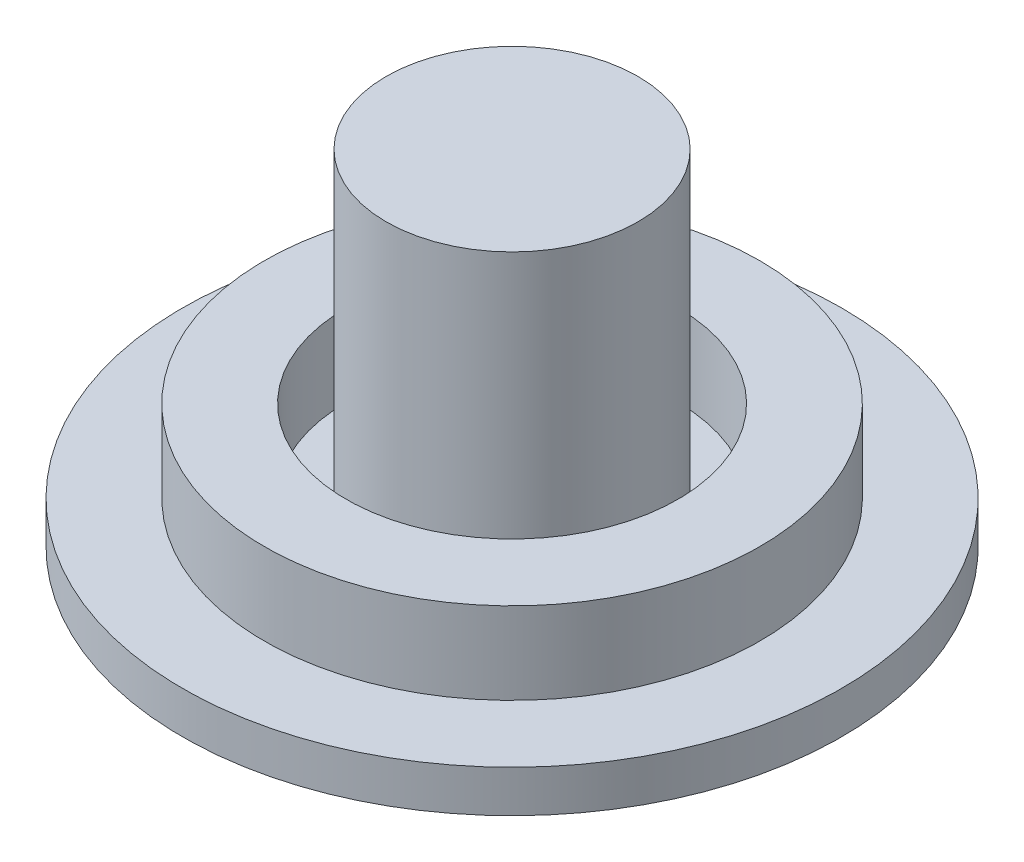
ISO-10303-21;
HEADER;
FILE_DESCRIPTION(('STEP AP214'),'2;1');
FILE_NAME('part.step','',(''),(''),'','','');
FILE_SCHEMA(('AUTOMOTIVE_DESIGN { 1 0 10303 214 1 1 1 1 }'));
ENDSEC;
DATA;
#1=APPLICATION_CONTEXT('core data for automotive mechanical design processes');
#2=APPLICATION_PROTOCOL_DEFINITION('international standard','automotive_design',2000,#1);
#3=PRODUCT_CONTEXT('',#1,'mechanical');
#4=PRODUCT('Part','Part','',(#3));
#5=PRODUCT_RELATED_PRODUCT_CATEGORY('part','',(#4));
#6=PRODUCT_DEFINITION_FORMATION('','',#4);
#7=PRODUCT_DEFINITION_CONTEXT('part definition',#1,'design');
#8=PRODUCT_DEFINITION('design','',#6,#7);
#9=PRODUCT_DEFINITION_SHAPE('','',#8);
#10=(LENGTH_UNIT() NAMED_UNIT(*) SI_UNIT(.MILLI.,.METRE.));
#11=(NAMED_UNIT(*) PLANE_ANGLE_UNIT() SI_UNIT($,.RADIAN.));
#12=(NAMED_UNIT(*) SI_UNIT($,.STERADIAN.) SOLID_ANGLE_UNIT());
#13=UNCERTAINTY_MEASURE_WITH_UNIT(LENGTH_MEASURE(1.E-05),#10,'distance_accuracy_value','');
#14=(GEOMETRIC_REPRESENTATION_CONTEXT(3) GLOBAL_UNCERTAINTY_ASSIGNED_CONTEXT((#13)) GLOBAL_UNIT_ASSIGNED_CONTEXT((#10,
#11,#12)) REPRESENTATION_CONTEXT('',''));
#15=CARTESIAN_POINT('',(0.,0.,0.));
#16=DIRECTION('',(0.,0.,1.));
#17=DIRECTION('',(1.,0.,0.));
#18=AXIS2_PLACEMENT_3D('',#15,#16,#17);
#19=CARTESIAN_POINT('',(0.,8.2,0.));
#20=DIRECTION('',(0.,1.,0.));
#21=DIRECTION('',(0.,0.,1.));
#22=AXIS2_PLACEMENT_3D('',#19,#20,#21);
#23=PLANE('',#22);
#24=CARTESIAN_POINT('',(0.,8.2,0.));
#25=DIRECTION('',(0.,-1.,0.));
#26=DIRECTION('',(0.,0.,-1.));
#27=AXIS2_PLACEMENT_3D('',#24,#25,#26);
#28=CIRCLE('',#27,3.);
#29=CARTESIAN_POINT('',(0.,8.2,-3.));
#30=VERTEX_POINT('',#29);
#31=EDGE_CURVE('E10',#30,#30,#28,.T.);
#32=ORIENTED_EDGE('',*,*,#31,.F.);
#33=EDGE_LOOP('',(#32));
#34=FACE_BOUND('',#33,.T.);
#35=ADVANCED_FACE('F32',(#34),#23,.T.);
#36=CARTESIAN_POINT('',(0.,0.,0.));
#37=DIRECTION('',(0.,-1.,0.));
#38=DIRECTION('',(0.,0.,-1.));
#39=AXIS2_PLACEMENT_3D('',#36,#37,#38);
#40=CYLINDRICAL_SURFACE('',#39,3.);
#41=ORIENTED_EDGE('',*,*,#31,.T.);
#42=EDGE_LOOP('',(#41));
#43=FACE_BOUND('',#42,.T.);
#44=CARTESIAN_POINT('',(0.,1.,0.));
#45=DIRECTION('',(0.,-1.,0.));
#46=DIRECTION('',(0.,0.,-1.));
#47=AXIS2_PLACEMENT_3D('',#44,#45,#46);
#48=CIRCLE('',#47,3.);
#49=CARTESIAN_POINT('',(0.,1.,-3.));
#50=VERTEX_POINT('',#49);
#51=EDGE_CURVE('E38',#50,#50,#48,.T.);
#52=ORIENTED_EDGE('',*,*,#51,.F.);
#53=EDGE_LOOP('',(#52));
#54=FACE_BOUND('',#53,.T.);
#55=ADVANCED_FACE('F80',(#43,#54),#40,.T.);
#56=CARTESIAN_POINT('',(0.,1.,-3.95));
#57=DIRECTION('',(0.,1.,0.));
#58=DIRECTION('',(0.,0.,1.));
#59=AXIS2_PLACEMENT_3D('',#56,#57,#58);
#60=PLANE('',#59);
#61=ORIENTED_EDGE('',*,*,#51,.T.);
#62=EDGE_LOOP('',(#61));
#63=FACE_BOUND('',#62,.T.);
#64=CARTESIAN_POINT('',(0.,1.,0.));
#65=DIRECTION('',(0.,-1.,0.));
#66=DIRECTION('',(0.,0.,-1.));
#67=AXIS2_PLACEMENT_3D('',#64,#65,#66);
#68=CIRCLE('',#67,3.95);
#69=CARTESIAN_POINT('',(0.,1.,-3.95));
#70=VERTEX_POINT('',#69);
#71=EDGE_CURVE('E42',#70,#70,#68,.T.);
#72=ORIENTED_EDGE('',*,*,#71,.F.);
#73=EDGE_LOOP('',(#72));
#74=FACE_BOUND('',#73,.T.);
#75=ADVANCED_FACE('F85',(#63,#74),#60,.T.);
#76=CARTESIAN_POINT('',(0.,0.,0.));
#77=DIRECTION('',(0.,-1.,0.));
#78=DIRECTION('',(0.,0.,-1.));
#79=AXIS2_PLACEMENT_3D('',#76,#77,#78);
#80=CYLINDRICAL_SURFACE('',#79,3.95);
#81=ORIENTED_EDGE('',*,*,#71,.T.);
#82=EDGE_LOOP('',(#81));
#83=FACE_BOUND('',#82,.T.);
#84=CARTESIAN_POINT('',(0.,2.95,0.));
#85=DIRECTION('',(0.,-1.,0.));
#86=DIRECTION('',(0.,0.,-1.));
#87=AXIS2_PLACEMENT_3D('',#84,#85,#86);
#88=CIRCLE('',#87,3.95);
#89=CARTESIAN_POINT('',(0.,2.95,-3.95));
#90=VERTEX_POINT('',#89);
#91=EDGE_CURVE('E46',#90,#90,#88,.T.);
#92=ORIENTED_EDGE('',*,*,#91,.F.);
#93=EDGE_LOOP('',(#92));
#94=FACE_BOUND('',#93,.T.);
#95=ADVANCED_FACE('F89',(#83,#94),#80,.F.);
#96=CARTESIAN_POINT('',(0.,2.95,-3.95));
#97=DIRECTION('',(0.,1.,0.));
#98=DIRECTION('',(0.,0.,1.));
#99=AXIS2_PLACEMENT_3D('',#96,#97,#98);
#100=PLANE('',#99);
#101=ORIENTED_EDGE('',*,*,#91,.T.);
#102=EDGE_LOOP('',(#101));
#103=FACE_BOUND('',#102,.T.);
#104=CARTESIAN_POINT('',(0.,2.95,0.));
#105=DIRECTION('',(0.,-1.,0.));
#106=DIRECTION('',(0.,0.,-1.));
#107=AXIS2_PLACEMENT_3D('',#104,#105,#106);
#108=CIRCLE('',#107,5.9);
#109=CARTESIAN_POINT('',(0.,2.95,-5.9));
#110=VERTEX_POINT('',#109);
#111=EDGE_CURVE('E51',#110,#110,#108,.T.);
#112=ORIENTED_EDGE('',*,*,#111,.F.);
#113=EDGE_LOOP('',(#112));
#114=FACE_BOUND('',#113,.T.);
#115=ADVANCED_FACE('F95',(#103,#114),#100,.T.);
#116=CARTESIAN_POINT('',(0.,0.,0.));
#117=DIRECTION('',(0.,-1.,0.));
#118=DIRECTION('',(0.,0.,-1.));
#119=AXIS2_PLACEMENT_3D('',#116,#117,#118);
#120=CYLINDRICAL_SURFACE('',#119,5.9);
#121=ORIENTED_EDGE('',*,*,#111,.T.);
#122=EDGE_LOOP('',(#121));
#123=FACE_BOUND('',#122,.T.);
#124=CARTESIAN_POINT('',(0.,1.,0.));
#125=DIRECTION('',(0.,-1.,0.));
#126=DIRECTION('',(0.,0.,-1.));
#127=AXIS2_PLACEMENT_3D('',#124,#125,#126);
#128=CIRCLE('',#127,5.9);
#129=CARTESIAN_POINT('',(0.,1.,-5.9));
#130=VERTEX_POINT('',#129);
#131=EDGE_CURVE('E54',#130,#130,#128,.T.);
#132=ORIENTED_EDGE('',*,*,#131,.F.);
#133=EDGE_LOOP('',(#132));
#134=FACE_BOUND('',#133,.T.);
#135=ADVANCED_FACE('F76',(#123,#134),#120,.T.);
#136=CARTESIAN_POINT('',(0.,1.,-5.9));
#137=DIRECTION('',(0.,1.,0.));
#138=DIRECTION('',(0.,0.,1.));
#139=AXIS2_PLACEMENT_3D('',#136,#137,#138);
#140=PLANE('',#139);
#141=ORIENTED_EDGE('',*,*,#131,.T.);
#142=EDGE_LOOP('',(#141));
#143=FACE_BOUND('',#142,.T.);
#144=CARTESIAN_POINT('',(0.,1.,0.));
#145=DIRECTION('',(0.,-1.,0.));
#146=DIRECTION('',(0.,0.,-1.));
#147=AXIS2_PLACEMENT_3D('',#144,#145,#146);
#148=CIRCLE('',#147,7.85);
#149=CARTESIAN_POINT('',(0.,1.,-7.85));
#150=VERTEX_POINT('',#149);
#151=EDGE_CURVE('E57',#150,#150,#148,.T.);
#152=ORIENTED_EDGE('',*,*,#151,.F.);
#153=EDGE_LOOP('',(#152));
#154=FACE_BOUND('',#153,.T.);
#155=ADVANCED_FACE('F68',(#143,#154),#140,.T.);
#156=CARTESIAN_POINT('',(0.,0.,0.));
#157=DIRECTION('',(0.,-1.,0.));
#158=DIRECTION('',(0.,0.,-1.));
#159=AXIS2_PLACEMENT_3D('',#156,#157,#158);
#160=CYLINDRICAL_SURFACE('',#159,7.85);
#161=ORIENTED_EDGE('',*,*,#151,.T.);
#162=EDGE_LOOP('',(#161));
#163=FACE_BOUND('',#162,.T.);
#164=CARTESIAN_POINT('',(0.,0.,0.));
#165=DIRECTION('',(0.,-1.,0.));
#166=DIRECTION('',(0.,0.,-1.));
#167=AXIS2_PLACEMENT_3D('',#164,#165,#166);
#168=CIRCLE('',#167,7.85);
#169=CARTESIAN_POINT('',(0.,0.,-7.85));
#170=VERTEX_POINT('',#169);
#171=EDGE_CURVE('E60',#170,#170,#168,.T.);
#172=ORIENTED_EDGE('',*,*,#171,.F.);
#173=EDGE_LOOP('',(#172));
#174=FACE_BOUND('',#173,.T.);
#175=ADVANCED_FACE('F66',(#163,#174),#160,.T.);
#176=CARTESIAN_POINT('',(0.,0.,-7.85));
#177=DIRECTION('',(0.,-1.,0.));
#178=DIRECTION('',(0.,0.,-1.));
#179=AXIS2_PLACEMENT_3D('',#176,#177,#178);
#180=PLANE('',#179);
#181=ORIENTED_EDGE('',*,*,#171,.T.);
#182=EDGE_LOOP('',(#181));
#183=FACE_BOUND('',#182,.T.);
#184=ADVANCED_FACE('F64',(#183),#180,.T.);
#185=CLOSED_SHELL('',(#35,#55,#75,#95,#115,#135,#155,#175,#184));
#186=MANIFOLD_SOLID_BREP('B2',#185);
#187=ADVANCED_BREP_SHAPE_REPRESENTATION('',(#18,#186),#14);
#188=SHAPE_DEFINITION_REPRESENTATION(#9,#187);
ENDSEC;
END-ISO-10303-21;
